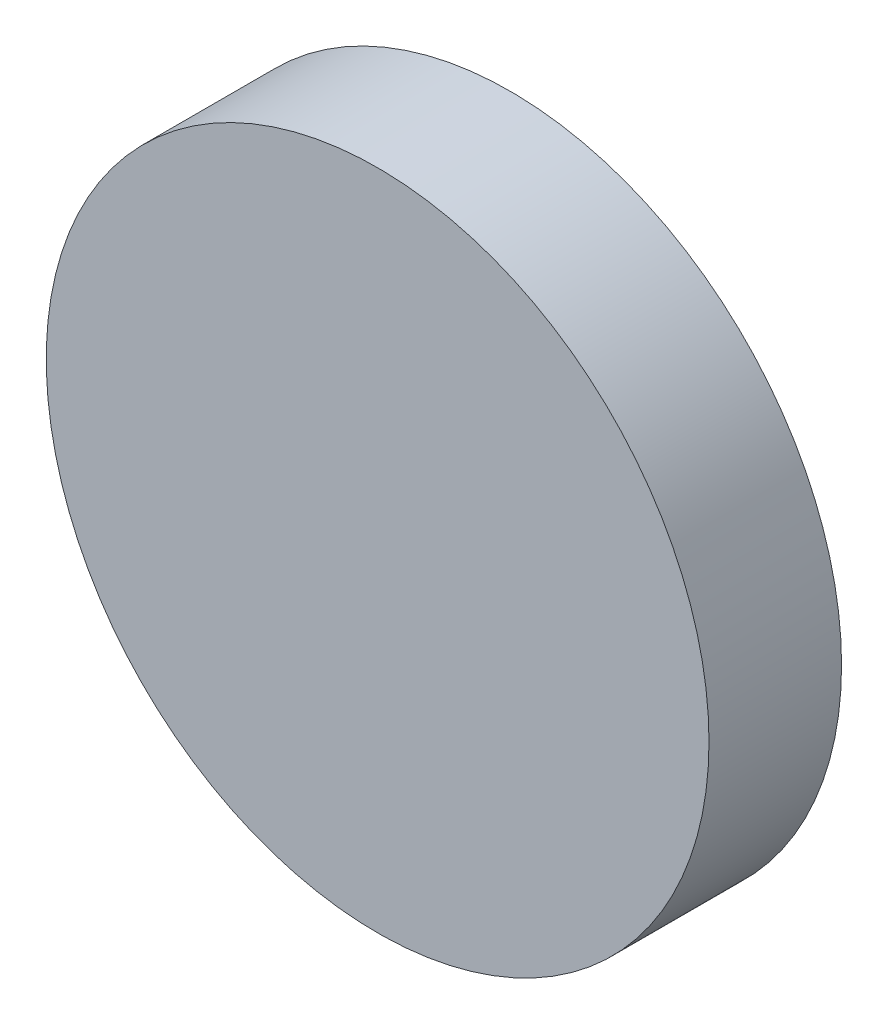
ISO-10303-21;
HEADER;
FILE_DESCRIPTION(('STEP AP214'),'2;1');
FILE_NAME('part.step','',(''),(''),'','','');
FILE_SCHEMA(('AUTOMOTIVE_DESIGN { 1 0 10303 214 1 1 1 1 }'));
ENDSEC;
DATA;
#1=APPLICATION_CONTEXT('core data for automotive mechanical design processes');
#2=APPLICATION_PROTOCOL_DEFINITION('international standard','automotive_design',2000,#1);
#3=PRODUCT_CONTEXT('',#1,'mechanical');
#4=PRODUCT('Part','Part','',(#3));
#5=PRODUCT_RELATED_PRODUCT_CATEGORY('part','',(#4));
#6=PRODUCT_DEFINITION_FORMATION('','',#4);
#7=PRODUCT_DEFINITION_CONTEXT('part definition',#1,'design');
#8=PRODUCT_DEFINITION('design','',#6,#7);
#9=PRODUCT_DEFINITION_SHAPE('','',#8);
#10=(LENGTH_UNIT() NAMED_UNIT(*) SI_UNIT(.MILLI.,.METRE.));
#11=(NAMED_UNIT(*) PLANE_ANGLE_UNIT() SI_UNIT($,.RADIAN.));
#12=(NAMED_UNIT(*) SI_UNIT($,.STERADIAN.) SOLID_ANGLE_UNIT());
#13=UNCERTAINTY_MEASURE_WITH_UNIT(LENGTH_MEASURE(1.E-05),#10,'distance_accuracy_value','');
#14=(GEOMETRIC_REPRESENTATION_CONTEXT(3) GLOBAL_UNCERTAINTY_ASSIGNED_CONTEXT((#13)) GLOBAL_UNIT_ASSIGNED_CONTEXT((#10,
#11,#12)) REPRESENTATION_CONTEXT('',''));
#15=CARTESIAN_POINT('',(0.,0.,0.));
#16=DIRECTION('',(0.,0.,1.));
#17=DIRECTION('',(1.,0.,0.));
#18=AXIS2_PLACEMENT_3D('',#15,#16,#17);
#19=CARTESIAN_POINT('',(0.,0.,-12.));
#20=DIRECTION('',(0.,0.,1.));
#21=DIRECTION('',(1.,0.,0.));
#22=AXIS2_PLACEMENT_3D('',#19,#20,#21);
#23=CYLINDRICAL_SURFACE('',#22,30.);
#24=CARTESIAN_POINT('',(0.,0.,-12.));
#25=DIRECTION('',(0.,0.,1.));
#26=DIRECTION('',(1.,0.,0.));
#27=AXIS2_PLACEMENT_3D('',#24,#25,#26);
#28=CIRCLE('',#27,30.);
#29=CARTESIAN_POINT('',(30.,0.,-12.));
#30=VERTEX_POINT('',#29);
#31=EDGE_CURVE('E10',#30,#30,#28,.T.);
#32=ORIENTED_EDGE('',*,*,#31,.T.);
#33=EDGE_LOOP('',(#32));
#34=FACE_BOUND('',#33,.T.);
#35=CARTESIAN_POINT('',(0.,0.,0.));
#36=DIRECTION('',(0.,0.,1.));
#37=DIRECTION('',(1.,0.,0.));
#38=AXIS2_PLACEMENT_3D('',#35,#36,#37);
#39=CIRCLE('',#38,30.);
#40=CARTESIAN_POINT('',(30.,0.,0.));
#41=VERTEX_POINT('',#40);
#42=EDGE_CURVE('E37',#41,#41,#39,.T.);
#43=ORIENTED_EDGE('',*,*,#42,.F.);
#44=EDGE_LOOP('',(#43));
#45=FACE_BOUND('',#44,.T.);
#46=ADVANCED_FACE('F40',(#34,#45),#23,.T.);
#47=CARTESIAN_POINT('',(0.,0.,-12.));
#48=DIRECTION('',(0.,0.,1.));
#49=DIRECTION('',(1.,0.,0.));
#50=AXIS2_PLACEMENT_3D('',#47,#48,#49);
#51=PLANE('',#50);
#52=ORIENTED_EDGE('',*,*,#31,.F.);
#53=EDGE_LOOP('',(#52));
#54=FACE_BOUND('',#53,.T.);
#55=ADVANCED_FACE('F55',(#54),#51,.F.);
#56=CARTESIAN_POINT('',(0.,0.,0.));
#57=DIRECTION('',(0.,0.,1.));
#58=DIRECTION('',(1.,0.,0.));
#59=AXIS2_PLACEMENT_3D('',#56,#57,#58);
#60=PLANE('',#59);
#61=ORIENTED_EDGE('',*,*,#42,.T.);
#62=EDGE_LOOP('',(#61));
#63=FACE_BOUND('',#62,.T.);
#64=ADVANCED_FACE('F47',(#63),#60,.T.);
#65=CLOSED_SHELL('',(#46,#55,#64));
#66=MANIFOLD_SOLID_BREP('B2',#65);
#67=ADVANCED_BREP_SHAPE_REPRESENTATION('',(#18,#66),#14);
#68=SHAPE_DEFINITION_REPRESENTATION(#9,#67);
ENDSEC;
END-ISO-10303-21;
